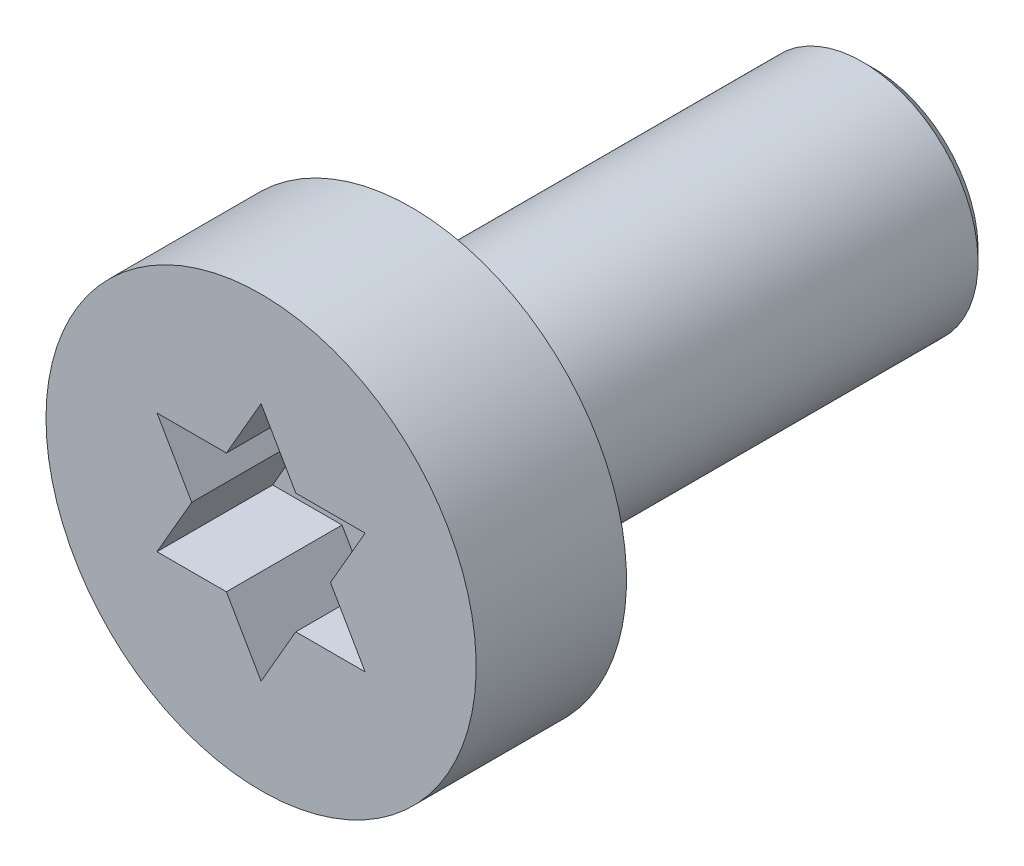
ISO-10303-21;
HEADER;
FILE_DESCRIPTION(('STEP AP214'),'2;1');
FILE_NAME('part.step','',(''),(''),'','','');
FILE_SCHEMA(('AUTOMOTIVE_DESIGN { 1 0 10303 214 1 1 1 1 }'));
ENDSEC;
DATA;
#1=APPLICATION_CONTEXT('core data for automotive mechanical design processes');
#2=APPLICATION_PROTOCOL_DEFINITION('international standard','automotive_design',2000,#1);
#3=PRODUCT_CONTEXT('',#1,'mechanical');
#4=PRODUCT('Part','Part','',(#3));
#5=PRODUCT_RELATED_PRODUCT_CATEGORY('part','',(#4));
#6=PRODUCT_DEFINITION_FORMATION('','',#4);
#7=PRODUCT_DEFINITION_CONTEXT('part definition',#1,'design');
#8=PRODUCT_DEFINITION('design','',#6,#7);
#9=PRODUCT_DEFINITION_SHAPE('','',#8);
#10=(LENGTH_UNIT() NAMED_UNIT(*) SI_UNIT(.MILLI.,.METRE.));
#11=(NAMED_UNIT(*) PLANE_ANGLE_UNIT() SI_UNIT($,.RADIAN.));
#12=(NAMED_UNIT(*) SI_UNIT($,.STERADIAN.) SOLID_ANGLE_UNIT());
#13=UNCERTAINTY_MEASURE_WITH_UNIT(LENGTH_MEASURE(1.E-05),#10,'distance_accuracy_value','');
#14=(GEOMETRIC_REPRESENTATION_CONTEXT(3) GLOBAL_UNCERTAINTY_ASSIGNED_CONTEXT((#13)) GLOBAL_UNIT_ASSIGNED_CONTEXT((#10,
#11,#12)) REPRESENTATION_CONTEXT('',''));
#15=CARTESIAN_POINT('',(0.,0.,0.));
#16=DIRECTION('',(0.,0.,1.));
#17=DIRECTION('',(1.,0.,0.));
#18=AXIS2_PLACEMENT_3D('',#15,#16,#17);
#19=CARTESIAN_POINT('',(0.,0.,4.3));
#20=DIRECTION('',(0.,0.,1.));
#21=DIRECTION('',(1.,0.,0.));
#22=AXIS2_PLACEMENT_3D('',#19,#20,#21);
#23=PLANE('',#22);
#24=DIRECTION('',(0.5,0.866025403784439,0.));
#25=VECTOR('',#24,1.);
#26=CARTESIAN_POINT('',(-0.45,0.259807621135331,4.3));
#27=LINE('',#26,#25);
#28=CARTESIAN_POINT('',(-0.3,0.519615242270663,4.3));
#29=VERTEX_POINT('',#28);
#30=CARTESIAN_POINT('',(0.,1.03923048454133,4.3));
#31=VERTEX_POINT('',#30);
#32=EDGE_CURVE('E145',#29,#31,#27,.T.);
#33=ORIENTED_EDGE('',*,*,#32,.F.);
#34=DIRECTION('',(1.,0.,0.));
#35=VECTOR('',#34,1.);
#36=CARTESIAN_POINT('',(0.,0.519615242270663,4.3));
#37=LINE('',#36,#35);
#38=CARTESIAN_POINT('',(-0.9,0.519615242270664,4.3));
#39=VERTEX_POINT('',#38);
#40=EDGE_CURVE('E127',#39,#29,#37,.T.);
#41=ORIENTED_EDGE('',*,*,#40,.F.);
#42=DIRECTION('',(0.5,-0.866025403784439,0.));
#43=VECTOR('',#42,1.);
#44=CARTESIAN_POINT('',(-0.45,-0.259807621135332,4.3));
#45=LINE('',#44,#43);
#46=CARTESIAN_POINT('',(-0.6,0.,4.3));
#47=VERTEX_POINT('',#46);
#48=EDGE_CURVE('E133',#39,#47,#45,.T.);
#49=ORIENTED_EDGE('',*,*,#48,.T.);
#50=DIRECTION('',(0.5,0.866025403784439,0.));
#51=VECTOR('',#50,1.);
#52=CARTESIAN_POINT('',(-0.45,0.259807621135331,4.3));
#53=LINE('',#52,#51);
#54=CARTESIAN_POINT('',(-0.9,-0.519615242270663,4.3));
#55=VERTEX_POINT('',#54);
#56=EDGE_CURVE('E225',#55,#47,#53,.T.);
#57=ORIENTED_EDGE('',*,*,#56,.F.);
#58=DIRECTION('',(1.,0.,0.));
#59=VECTOR('',#58,1.);
#60=CARTESIAN_POINT('',(0.,-0.519615242270663,4.3));
#61=LINE('',#60,#59);
#62=CARTESIAN_POINT('',(-0.3,-0.519615242270663,4.3));
#63=VERTEX_POINT('',#62);
#64=EDGE_CURVE('E232',#55,#63,#61,.T.);
#65=ORIENTED_EDGE('',*,*,#64,.T.);
#66=DIRECTION('',(0.5,-0.866025403784439,0.));
#67=VECTOR('',#66,1.);
#68=CARTESIAN_POINT('',(-0.45,-0.259807621135332,4.3));
#69=LINE('',#68,#67);
#70=CARTESIAN_POINT('',(0.,-1.03923048454133,4.3));
#71=VERTEX_POINT('',#70);
#72=EDGE_CURVE('E238',#63,#71,#69,.T.);
#73=ORIENTED_EDGE('',*,*,#72,.T.);
#74=DIRECTION('',(-0.5,-0.866025403784439,0.));
#75=VECTOR('',#74,1.);
#76=CARTESIAN_POINT('',(0.45,-0.259807621135332,4.3));
#77=LINE('',#76,#75);
#78=CARTESIAN_POINT('',(0.3,-0.519615242270663,4.3));
#79=VERTEX_POINT('',#78);
#80=EDGE_CURVE('E241',#79,#71,#77,.T.);
#81=ORIENTED_EDGE('',*,*,#80,.F.);
#82=DIRECTION('',(1.,0.,0.));
#83=VECTOR('',#82,1.);
#84=CARTESIAN_POINT('',(0.,-0.519615242270663,4.3));
#85=LINE('',#84,#83);
#86=CARTESIAN_POINT('',(0.900000000000001,-0.519615242270663,4.3));
#87=VERTEX_POINT('',#86);
#88=EDGE_CURVE('E252',#79,#87,#85,.T.);
#89=ORIENTED_EDGE('',*,*,#88,.T.);
#90=DIRECTION('',(-0.5,0.866025403784439,0.));
#91=VECTOR('',#90,1.);
#92=CARTESIAN_POINT('',(0.45,0.259807621135332,4.3));
#93=LINE('',#92,#91);
#94=CARTESIAN_POINT('',(0.6,0.,4.3));
#95=VERTEX_POINT('',#94);
#96=EDGE_CURVE('E258',#87,#95,#93,.T.);
#97=ORIENTED_EDGE('',*,*,#96,.T.);
#98=DIRECTION('',(-0.5,-0.866025403784439,0.));
#99=VECTOR('',#98,1.);
#100=CARTESIAN_POINT('',(0.45,-0.259807621135332,4.3));
#101=LINE('',#100,#99);
#102=CARTESIAN_POINT('',(0.9,0.519615242270663,4.3));
#103=VERTEX_POINT('',#102);
#104=EDGE_CURVE('E261',#103,#95,#101,.T.);
#105=ORIENTED_EDGE('',*,*,#104,.F.);
#106=DIRECTION('',(1.,0.,0.));
#107=VECTOR('',#106,1.);
#108=CARTESIAN_POINT('',(0.,0.519615242270663,4.3));
#109=LINE('',#108,#107);
#110=CARTESIAN_POINT('',(0.3,0.519615242270663,4.3));
#111=VERTEX_POINT('',#110);
#112=EDGE_CURVE('E269',#111,#103,#109,.T.);
#113=ORIENTED_EDGE('',*,*,#112,.F.);
#114=DIRECTION('',(-0.5,0.866025403784439,0.));
#115=VECTOR('',#114,1.);
#116=CARTESIAN_POINT('',(0.45,0.259807621135332,4.3));
#117=LINE('',#116,#115);
#118=EDGE_CURVE('E279',#111,#31,#117,.T.);
#119=ORIENTED_EDGE('',*,*,#118,.T.);
#120=EDGE_LOOP('',(#33,#41,#49,#57,#65,#73,#81,#89,#97,#105,#113,#119));
#121=FACE_BOUND('',#120,.T.);
#122=ADVANCED_FACE('F16',(#121),#23,.T.);
#123=CARTESIAN_POINT('',(-0.45,-0.259807621135332,4.3));
#124=DIRECTION('',(-0.866025403784439,-0.5,0.));
#125=DIRECTION('',(0.5,-0.866025403784439,0.));
#126=AXIS2_PLACEMENT_3D('',#123,#124,#125);
#127=PLANE('',#126);
#128=DIRECTION('',(0.,0.,1.));
#129=VECTOR('',#128,1.);
#130=CARTESIAN_POINT('',(-0.6,0.,4.3));
#131=LINE('',#130,#129);
#132=CARTESIAN_POINT('',(-0.6,0.,5.3));
#133=VERTEX_POINT('',#132);
#134=EDGE_CURVE('E138',#47,#133,#131,.T.);
#135=ORIENTED_EDGE('',*,*,#134,.F.);
#136=ORIENTED_EDGE('',*,*,#48,.F.);
#137=DIRECTION('',(0.,0.,-1.));
#138=VECTOR('',#137,1.);
#139=CARTESIAN_POINT('',(-0.9,0.519615242270663,4.3));
#140=LINE('',#139,#138);
#141=CARTESIAN_POINT('',(-0.9,0.519615242270664,5.3));
#142=VERTEX_POINT('',#141);
#143=EDGE_CURVE('E135',#142,#39,#140,.T.);
#144=ORIENTED_EDGE('',*,*,#143,.F.);
#145=DIRECTION('',(-0.5,0.866025403784438,0.));
#146=VECTOR('',#145,1.);
#147=CARTESIAN_POINT('',(-0.6,0.,5.3));
#148=LINE('',#147,#146);
#149=EDGE_CURVE('E220',#133,#142,#148,.T.);
#150=ORIENTED_EDGE('',*,*,#149,.F.);
#151=EDGE_LOOP('',(#135,#136,#144,#150));
#152=FACE_BOUND('',#151,.T.);
#153=ADVANCED_FACE('F134',(#152),#127,.F.);
#154=CARTESIAN_POINT('',(0.,0.519615242270663,4.3));
#155=DIRECTION('',(0.,-1.,0.));
#156=DIRECTION('',(0.,0.,-1.));
#157=AXIS2_PLACEMENT_3D('',#154,#155,#156);
#158=PLANE('',#157);
#159=ORIENTED_EDGE('',*,*,#40,.T.);
#160=DIRECTION('',(0.,0.,1.));
#161=VECTOR('',#160,1.);
#162=CARTESIAN_POINT('',(-0.3,0.519615242270664,4.3));
#163=LINE('',#162,#161);
#164=CARTESIAN_POINT('',(-0.3,0.519615242270663,5.3));
#165=VERTEX_POINT('',#164);
#166=EDGE_CURVE('E148',#165,#29,#163,.F.);
#167=ORIENTED_EDGE('',*,*,#166,.F.);
#168=DIRECTION('',(1.,0.,0.));
#169=VECTOR('',#168,1.);
#170=CARTESIAN_POINT('',(0.,0.519615242270663,5.3));
#171=LINE('',#170,#169);
#172=EDGE_CURVE('E152',#142,#165,#171,.T.);
#173=ORIENTED_EDGE('',*,*,#172,.F.);
#174=ORIENTED_EDGE('',*,*,#143,.T.);
#175=EDGE_LOOP('',(#159,#167,#173,#174));
#176=FACE_BOUND('',#175,.T.);
#177=ADVANCED_FACE('F150',(#176),#158,.T.);
#178=CARTESIAN_POINT('',(-0.45,0.259807621135331,4.3));
#179=DIRECTION('',(0.866025403784439,-0.5,0.));
#180=DIRECTION('',(0.5,0.866025403784439,0.));
#181=AXIS2_PLACEMENT_3D('',#178,#179,#180);
#182=PLANE('',#181);
#183=ORIENTED_EDGE('',*,*,#32,.T.);
#184=DIRECTION('',(0.,0.,1.));
#185=VECTOR('',#184,1.);
#186=CARTESIAN_POINT('',(0.,1.03923048454133,4.3));
#187=LINE('',#186,#185);
#188=CARTESIAN_POINT('',(0.,1.03923048454133,5.3));
#189=VERTEX_POINT('',#188);
#190=EDGE_CURVE('E276',#31,#189,#187,.T.);
#191=ORIENTED_EDGE('',*,*,#190,.T.);
#192=DIRECTION('',(0.5,0.866025403784439,0.));
#193=VECTOR('',#192,1.);
#194=CARTESIAN_POINT('',(-0.3,0.519615242270663,5.3));
#195=LINE('',#194,#193);
#196=EDGE_CURVE('E214',#165,#189,#195,.T.);
#197=ORIENTED_EDGE('',*,*,#196,.F.);
#198=ORIENTED_EDGE('',*,*,#166,.T.);
#199=EDGE_LOOP('',(#183,#191,#197,#198));
#200=FACE_BOUND('',#199,.T.);
#201=ADVANCED_FACE('F285',(#200),#182,.T.);
#202=CARTESIAN_POINT('',(0.45,0.259807621135332,4.3));
#203=DIRECTION('',(0.866025403784439,0.5,0.));
#204=DIRECTION('',(-0.5,0.866025403784439,0.));
#205=AXIS2_PLACEMENT_3D('',#202,#203,#204);
#206=PLANE('',#205);
#207=ORIENTED_EDGE('',*,*,#190,.F.);
#208=ORIENTED_EDGE('',*,*,#118,.F.);
#209=DIRECTION('',(0.,0.,-1.));
#210=VECTOR('',#209,1.);
#211=CARTESIAN_POINT('',(0.3,0.519615242270663,4.3));
#212=LINE('',#211,#210);
#213=CARTESIAN_POINT('',(0.3,0.519615242270663,5.3));
#214=VERTEX_POINT('',#213);
#215=EDGE_CURVE('E272',#214,#111,#212,.T.);
#216=ORIENTED_EDGE('',*,*,#215,.F.);
#217=DIRECTION('',(0.5,-0.866025403784438,0.));
#218=VECTOR('',#217,1.);
#219=CARTESIAN_POINT('',(0.,1.03923048454133,5.3));
#220=LINE('',#219,#218);
#221=EDGE_CURVE('E210',#189,#214,#220,.T.);
#222=ORIENTED_EDGE('',*,*,#221,.F.);
#223=EDGE_LOOP('',(#207,#208,#216,#222));
#224=FACE_BOUND('',#223,.T.);
#225=ADVANCED_FACE('F320',(#224),#206,.F.);
#226=CARTESIAN_POINT('',(0.,0.519615242270663,4.3));
#227=DIRECTION('',(0.,-1.,0.));
#228=DIRECTION('',(0.,0.,-1.));
#229=AXIS2_PLACEMENT_3D('',#226,#227,#228);
#230=PLANE('',#229);
#231=ORIENTED_EDGE('',*,*,#112,.T.);
#232=DIRECTION('',(0.,0.,1.));
#233=VECTOR('',#232,1.);
#234=CARTESIAN_POINT('',(0.9,0.519615242270664,4.3));
#235=LINE('',#234,#233);
#236=CARTESIAN_POINT('',(0.9,0.519615242270663,5.3));
#237=VERTEX_POINT('',#236);
#238=EDGE_CURVE('E265',#237,#103,#235,.F.);
#239=ORIENTED_EDGE('',*,*,#238,.F.);
#240=DIRECTION('',(1.,0.,0.));
#241=VECTOR('',#240,1.);
#242=CARTESIAN_POINT('',(0.,0.519615242270663,5.3));
#243=LINE('',#242,#241);
#244=EDGE_CURVE('E206',#214,#237,#243,.T.);
#245=ORIENTED_EDGE('',*,*,#244,.F.);
#246=ORIENTED_EDGE('',*,*,#215,.T.);
#247=EDGE_LOOP('',(#231,#239,#245,#246));
#248=FACE_BOUND('',#247,.T.);
#249=ADVANCED_FACE('F318',(#248),#230,.T.);
#250=CARTESIAN_POINT('',(0.45,-0.259807621135332,4.3));
#251=DIRECTION('',(-0.866025403784439,0.5,0.));
#252=DIRECTION('',(-0.5,-0.866025403784439,0.));
#253=AXIS2_PLACEMENT_3D('',#250,#251,#252);
#254=PLANE('',#253);
#255=ORIENTED_EDGE('',*,*,#104,.T.);
#256=DIRECTION('',(0.,0.,1.));
#257=VECTOR('',#256,1.);
#258=CARTESIAN_POINT('',(0.6,0.,4.3));
#259=LINE('',#258,#257);
#260=CARTESIAN_POINT('',(0.6,0.,5.3));
#261=VERTEX_POINT('',#260);
#262=EDGE_CURVE('E255',#95,#261,#259,.T.);
#263=ORIENTED_EDGE('',*,*,#262,.T.);
#264=DIRECTION('',(-0.5,-0.866025403784438,0.));
#265=VECTOR('',#264,1.);
#266=CARTESIAN_POINT('',(0.9,0.519615242270663,5.3));
#267=LINE('',#266,#265);
#268=EDGE_CURVE('E202',#237,#261,#267,.T.);
#269=ORIENTED_EDGE('',*,*,#268,.F.);
#270=ORIENTED_EDGE('',*,*,#238,.T.);
#271=EDGE_LOOP('',(#255,#263,#269,#270));
#272=FACE_BOUND('',#271,.T.);
#273=ADVANCED_FACE('F315',(#272),#254,.T.);
#274=CARTESIAN_POINT('',(0.45,0.259807621135332,4.3));
#275=DIRECTION('',(0.866025403784439,0.5,0.));
#276=DIRECTION('',(-0.5,0.866025403784439,0.));
#277=AXIS2_PLACEMENT_3D('',#274,#275,#276);
#278=PLANE('',#277);
#279=ORIENTED_EDGE('',*,*,#262,.F.);
#280=ORIENTED_EDGE('',*,*,#96,.F.);
#281=DIRECTION('',(0.,0.,-1.));
#282=VECTOR('',#281,1.);
#283=CARTESIAN_POINT('',(0.9,-0.519615242270663,4.3));
#284=LINE('',#283,#282);
#285=CARTESIAN_POINT('',(0.900000000000001,-0.519615242270663,5.3));
#286=VERTEX_POINT('',#285);
#287=EDGE_CURVE('E249',#87,#286,#284,.F.);
#288=ORIENTED_EDGE('',*,*,#287,.T.);
#289=DIRECTION('',(0.500000000000001,-0.866025403784438,0.));
#290=VECTOR('',#289,1.);
#291=CARTESIAN_POINT('',(0.6,0.,5.3));
#292=LINE('',#291,#290);
#293=EDGE_CURVE('E198',#261,#286,#292,.T.);
#294=ORIENTED_EDGE('',*,*,#293,.F.);
#295=EDGE_LOOP('',(#279,#280,#288,#294));
#296=FACE_BOUND('',#295,.T.);
#297=ADVANCED_FACE('F309',(#296),#278,.F.);
#298=CARTESIAN_POINT('',(0.,-0.519615242270663,4.3));
#299=DIRECTION('',(0.,-1.,0.));
#300=DIRECTION('',(0.,0.,-1.));
#301=AXIS2_PLACEMENT_3D('',#298,#299,#300);
#302=PLANE('',#301);
#303=ORIENTED_EDGE('',*,*,#287,.F.);
#304=ORIENTED_EDGE('',*,*,#88,.F.);
#305=DIRECTION('',(0.,0.,1.));
#306=VECTOR('',#305,1.);
#307=CARTESIAN_POINT('',(0.3,-0.519615242270663,4.3));
#308=LINE('',#307,#306);
#309=CARTESIAN_POINT('',(0.3,-0.519615242270663,5.3));
#310=VERTEX_POINT('',#309);
#311=EDGE_CURVE('E245',#310,#79,#308,.F.);
#312=ORIENTED_EDGE('',*,*,#311,.F.);
#313=DIRECTION('',(1.,0.,0.));
#314=VECTOR('',#313,1.);
#315=CARTESIAN_POINT('',(0.,-0.519615242270663,5.3));
#316=LINE('',#315,#314);
#317=EDGE_CURVE('E195',#286,#310,#316,.F.);
#318=ORIENTED_EDGE('',*,*,#317,.F.);
#319=EDGE_LOOP('',(#303,#304,#312,#318));
#320=FACE_BOUND('',#319,.T.);
#321=ADVANCED_FACE('F311',(#320),#302,.F.);
#322=CARTESIAN_POINT('',(0.45,-0.259807621135332,4.3));
#323=DIRECTION('',(-0.866025403784439,0.5,0.));
#324=DIRECTION('',(-0.5,-0.866025403784439,0.));
#325=AXIS2_PLACEMENT_3D('',#322,#323,#324);
#326=PLANE('',#325);
#327=ORIENTED_EDGE('',*,*,#80,.T.);
#328=DIRECTION('',(0.,0.,1.));
#329=VECTOR('',#328,1.);
#330=CARTESIAN_POINT('',(0.,-1.03923048454133,4.3));
#331=LINE('',#330,#329);
#332=CARTESIAN_POINT('',(0.,-1.03923048454133,5.3));
#333=VERTEX_POINT('',#332);
#334=EDGE_CURVE('E235',#71,#333,#331,.T.);
#335=ORIENTED_EDGE('',*,*,#334,.T.);
#336=DIRECTION('',(-0.5,-0.866025403784439,0.));
#337=VECTOR('',#336,1.);
#338=CARTESIAN_POINT('',(0.3,-0.519615242270663,5.3));
#339=LINE('',#338,#337);
#340=EDGE_CURVE('E191',#310,#333,#339,.T.);
#341=ORIENTED_EDGE('',*,*,#340,.F.);
#342=ORIENTED_EDGE('',*,*,#311,.T.);
#343=EDGE_LOOP('',(#327,#335,#341,#342));
#344=FACE_BOUND('',#343,.T.);
#345=ADVANCED_FACE('F302',(#344),#326,.T.);
#346=CARTESIAN_POINT('',(-0.45,-0.259807621135332,4.3));
#347=DIRECTION('',(-0.866025403784439,-0.5,0.));
#348=DIRECTION('',(0.5,-0.866025403784439,0.));
#349=AXIS2_PLACEMENT_3D('',#346,#347,#348);
#350=PLANE('',#349);
#351=ORIENTED_EDGE('',*,*,#334,.F.);
#352=ORIENTED_EDGE('',*,*,#72,.F.);
#353=DIRECTION('',(0.,0.,-1.));
#354=VECTOR('',#353,1.);
#355=CARTESIAN_POINT('',(-0.3,-0.519615242270663,4.3));
#356=LINE('',#355,#354);
#357=CARTESIAN_POINT('',(-0.3,-0.519615242270663,5.3));
#358=VERTEX_POINT('',#357);
#359=EDGE_CURVE('E229',#63,#358,#356,.F.);
#360=ORIENTED_EDGE('',*,*,#359,.T.);
#361=DIRECTION('',(-0.5,0.866025403784439,0.));
#362=VECTOR('',#361,1.);
#363=CARTESIAN_POINT('',(0.,-1.03923048454133,5.3));
#364=LINE('',#363,#362);
#365=EDGE_CURVE('E185',#333,#358,#364,.T.);
#366=ORIENTED_EDGE('',*,*,#365,.F.);
#367=EDGE_LOOP('',(#351,#352,#360,#366));
#368=FACE_BOUND('',#367,.T.);
#369=ADVANCED_FACE('F296',(#368),#350,.F.);
#370=CARTESIAN_POINT('',(0.,-0.519615242270663,4.3));
#371=DIRECTION('',(0.,-1.,0.));
#372=DIRECTION('',(0.,0.,-1.));
#373=AXIS2_PLACEMENT_3D('',#370,#371,#372);
#374=PLANE('',#373);
#375=ORIENTED_EDGE('',*,*,#359,.F.);
#376=ORIENTED_EDGE('',*,*,#64,.F.);
#377=DIRECTION('',(0.,0.,1.));
#378=VECTOR('',#377,1.);
#379=CARTESIAN_POINT('',(-0.9,-0.519615242270663,4.3));
#380=LINE('',#379,#378);
#381=CARTESIAN_POINT('',(-0.9,-0.519615242270663,5.3));
#382=VERTEX_POINT('',#381);
#383=EDGE_CURVE('E39',#382,#55,#380,.F.);
#384=ORIENTED_EDGE('',*,*,#383,.F.);
#385=DIRECTION('',(1.,0.,0.));
#386=VECTOR('',#385,1.);
#387=CARTESIAN_POINT('',(0.,-0.519615242270663,5.3));
#388=LINE('',#387,#386);
#389=EDGE_CURVE('E178',#358,#382,#388,.F.);
#390=ORIENTED_EDGE('',*,*,#389,.F.);
#391=EDGE_LOOP('',(#375,#376,#384,#390));
#392=FACE_BOUND('',#391,.T.);
#393=ADVANCED_FACE('F298',(#392),#374,.F.);
#394=CARTESIAN_POINT('',(-0.45,0.259807621135331,4.3));
#395=DIRECTION('',(0.866025403784439,-0.5,0.));
#396=DIRECTION('',(0.5,0.866025403784439,0.));
#397=AXIS2_PLACEMENT_3D('',#394,#395,#396);
#398=PLANE('',#397);
#399=ORIENTED_EDGE('',*,*,#56,.T.);
#400=ORIENTED_EDGE('',*,*,#134,.T.);
#401=DIRECTION('',(0.5,0.866025403784439,0.));
#402=VECTOR('',#401,1.);
#403=CARTESIAN_POINT('',(-0.9,-0.519615242270663,5.3));
#404=LINE('',#403,#402);
#405=EDGE_CURVE('E173',#382,#133,#404,.T.);
#406=ORIENTED_EDGE('',*,*,#405,.F.);
#407=ORIENTED_EDGE('',*,*,#383,.T.);
#408=EDGE_LOOP('',(#399,#400,#406,#407));
#409=FACE_BOUND('',#408,.T.);
#410=ADVANCED_FACE('F290',(#409),#398,.T.);
#411=CARTESIAN_POINT('',(0.,0.,5.3));
#412=DIRECTION('',(0.,0.,1.));
#413=DIRECTION('',(1.,0.,0.));
#414=AXIS2_PLACEMENT_3D('',#411,#412,#413);
#415=PLANE('',#414);
#416=CARTESIAN_POINT('',(0.,0.,5.3));
#417=DIRECTION('',(0.,0.,-1.));
#418=DIRECTION('',(-1.,0.,0.));
#419=AXIS2_PLACEMENT_3D('',#416,#417,#418);
#420=CIRCLE('',#419,1.86);
#421=CARTESIAN_POINT('',(-1.86,0.,5.3));
#422=VERTEX_POINT('',#421);
#423=EDGE_CURVE('E19',#422,#422,#420,.T.);
#424=ORIENTED_EDGE('',*,*,#423,.F.);
#425=EDGE_LOOP('',(#424));
#426=FACE_BOUND('',#425,.T.);
#427=ORIENTED_EDGE('',*,*,#389,.T.);
#428=ORIENTED_EDGE('',*,*,#405,.T.);
#429=ORIENTED_EDGE('',*,*,#149,.T.);
#430=ORIENTED_EDGE('',*,*,#172,.T.);
#431=ORIENTED_EDGE('',*,*,#196,.T.);
#432=ORIENTED_EDGE('',*,*,#221,.T.);
#433=ORIENTED_EDGE('',*,*,#244,.T.);
#434=ORIENTED_EDGE('',*,*,#268,.T.);
#435=ORIENTED_EDGE('',*,*,#293,.T.);
#436=ORIENTED_EDGE('',*,*,#317,.T.);
#437=ORIENTED_EDGE('',*,*,#340,.T.);
#438=ORIENTED_EDGE('',*,*,#365,.T.);
#439=EDGE_LOOP('',(#427,#428,#429,#430,#431,#432,#433,#434,#435,#436,#437,#438));
#440=FACE_BOUND('',#439,.T.);
#441=ADVANCED_FACE('F288',(#426,#440),#415,.T.);
#442=CARTESIAN_POINT('',(0.,0.,5.3));
#443=DIRECTION('',(0.,0.,-1.));
#444=DIRECTION('',(-1.,0.,0.));
#445=AXIS2_PLACEMENT_3D('',#442,#443,#444);
#446=CYLINDRICAL_SURFACE('',#445,1.86);
#447=ORIENTED_EDGE('',*,*,#423,.T.);
#448=EDGE_LOOP('',(#447));
#449=FACE_BOUND('',#448,.T.);
#450=CARTESIAN_POINT('',(0.,0.,4.));
#451=DIRECTION('',(0.,0.,-1.));
#452=DIRECTION('',(-1.,0.,0.));
#453=AXIS2_PLACEMENT_3D('',#450,#451,#452);
#454=CIRCLE('',#453,1.86);
#455=CARTESIAN_POINT('',(-1.86,0.,4.));
#456=VERTEX_POINT('',#455);
#457=EDGE_CURVE('E165',#456,#456,#454,.F.);
#458=ORIENTED_EDGE('',*,*,#457,.T.);
#459=EDGE_LOOP('',(#458));
#460=FACE_BOUND('',#459,.T.);
#461=ADVANCED_FACE('F349',(#449,#460),#446,.T.);
#462=CARTESIAN_POINT('',(0.,0.,0.));
#463=DIRECTION('',(0.,0.,1.));
#464=DIRECTION('',(1.,0.,0.));
#465=AXIS2_PLACEMENT_3D('',#462,#463,#464);
#466=PLANE('',#465);
#467=CARTESIAN_POINT('',(0.,0.,0.));
#468=DIRECTION('',(0.,0.,1.));
#469=DIRECTION('',(0.,-1.,0.));
#470=AXIS2_PLACEMENT_3D('',#467,#468,#469);
#471=CIRCLE('',#470,0.899999999944612);
#472=CARTESIAN_POINT('',(0.,-0.899999999944612,0.));
#473=VERTEX_POINT('',#472);
#474=EDGE_CURVE('E162',#473,#473,#471,.T.);
#475=ORIENTED_EDGE('',*,*,#474,.F.);
#476=EDGE_LOOP('',(#475));
#477=FACE_BOUND('',#476,.T.);
#478=ADVANCED_FACE('F345',(#477),#466,.F.);
#479=CARTESIAN_POINT('',(0.,0.,4.));
#480=DIRECTION('',(0.,0.,1.));
#481=DIRECTION('',(1.,0.,0.));
#482=AXIS2_PLACEMENT_3D('',#479,#480,#481);
#483=PLANE('',#482);
#484=CARTESIAN_POINT('',(0.,0.,4.));
#485=DIRECTION('',(0.,0.,-1.));
#486=DIRECTION('',(-1.,0.,0.));
#487=AXIS2_PLACEMENT_3D('',#484,#485,#486);
#488=CIRCLE('',#487,1.);
#489=CARTESIAN_POINT('',(-1.,0.,4.));
#490=VERTEX_POINT('',#489);
#491=EDGE_CURVE('E26',#490,#490,#488,.T.);
#492=ORIENTED_EDGE('',*,*,#491,.F.);
#493=EDGE_LOOP('',(#492));
#494=FACE_BOUND('',#493,.T.);
#495=ORIENTED_EDGE('',*,*,#457,.F.);
#496=EDGE_LOOP('',(#495));
#497=FACE_BOUND('',#496,.T.);
#498=ADVANCED_FACE('F338',(#494,#497),#483,.F.);
#499=CARTESIAN_POINT('',(0.,0.,0.0999999999748979));
#500=DIRECTION('',(0.,0.,1.));
#501=DIRECTION('',(0.,-1.,0.));
#502=AXIS2_PLACEMENT_3D('',#499,#500,#501);
#503=CONICAL_SURFACE('',#502,0.999999999976353,0.785398163681665);
#504=CARTESIAN_POINT('',(0.,0.,0.1));
#505=DIRECTION('',(0.,0.,-1.));
#506=DIRECTION('',(-1.,0.,0.));
#507=AXIS2_PLACEMENT_3D('',#504,#505,#506);
#508=CIRCLE('',#507,1.);
#509=CARTESIAN_POINT('',(-1.,0.,0.1));
#510=VERTEX_POINT('',#509);
#511=EDGE_CURVE('E11',#510,#510,#508,.F.);
#512=ORIENTED_EDGE('',*,*,#511,.F.);
#513=EDGE_LOOP('',(#512));
#514=FACE_BOUND('',#513,.T.);
#515=ORIENTED_EDGE('',*,*,#474,.T.);
#516=EDGE_LOOP('',(#515));
#517=FACE_BOUND('',#516,.T.);
#518=ADVANCED_FACE('F332',(#514,#517),#503,.T.);
#519=CARTESIAN_POINT('',(0.,0.,4.));
#520=DIRECTION('',(0.,0.,-1.));
#521=DIRECTION('',(-1.,0.,0.));
#522=AXIS2_PLACEMENT_3D('',#519,#520,#521);
#523=CYLINDRICAL_SURFACE('',#522,1.);
#524=ORIENTED_EDGE('',*,*,#511,.T.);
#525=EDGE_LOOP('',(#524));
#526=FACE_BOUND('',#525,.T.);
#527=ORIENTED_EDGE('',*,*,#491,.T.);
#528=EDGE_LOOP('',(#527));
#529=FACE_BOUND('',#528,.T.);
#530=ADVANCED_FACE('F330',(#526,#529),#523,.T.);
#531=CLOSED_SHELL('',(#122,#153,#177,#201,#225,#249,#273,#297,#321,#345,#369,#393,#410,#441,
#461,#478,#498,#518,#530));
#532=MANIFOLD_SOLID_BREP('B1',#531);
#533=ADVANCED_BREP_SHAPE_REPRESENTATION('',(#18,#532),#14);
#534=SHAPE_DEFINITION_REPRESENTATION(#9,#533);
ENDSEC;
END-ISO-10303-21;
